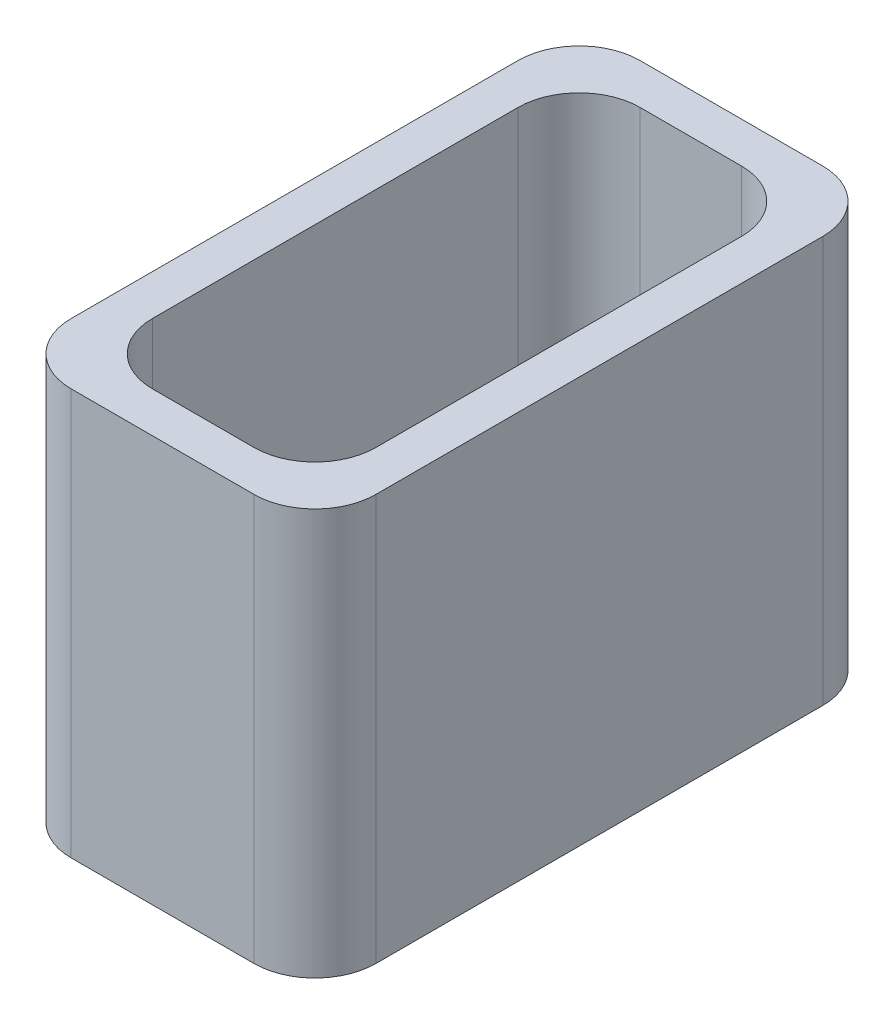
ISO-10303-21;
HEADER;
FILE_DESCRIPTION(('STEP AP214'),'2;1');
FILE_NAME('part.step','',(''),(''),'','','');
FILE_SCHEMA(('AUTOMOTIVE_DESIGN { 1 0 10303 214 1 1 1 1 }'));
ENDSEC;
DATA;
#1=APPLICATION_CONTEXT('core data for automotive mechanical design processes');
#2=APPLICATION_PROTOCOL_DEFINITION('international standard','automotive_design',2000,#1);
#3=PRODUCT_CONTEXT('',#1,'mechanical');
#4=PRODUCT('Part','Part','',(#3));
#5=PRODUCT_RELATED_PRODUCT_CATEGORY('part','',(#4));
#6=PRODUCT_DEFINITION_FORMATION('','',#4);
#7=PRODUCT_DEFINITION_CONTEXT('part definition',#1,'design');
#8=PRODUCT_DEFINITION('design','',#6,#7);
#9=PRODUCT_DEFINITION_SHAPE('','',#8);
#10=(LENGTH_UNIT() NAMED_UNIT(*) SI_UNIT(.MILLI.,.METRE.));
#11=(NAMED_UNIT(*) PLANE_ANGLE_UNIT() SI_UNIT($,.RADIAN.));
#12=(NAMED_UNIT(*) SI_UNIT($,.STERADIAN.) SOLID_ANGLE_UNIT());
#13=UNCERTAINTY_MEASURE_WITH_UNIT(LENGTH_MEASURE(1.E-05),#10,'distance_accuracy_value','');
#14=(GEOMETRIC_REPRESENTATION_CONTEXT(3) GLOBAL_UNCERTAINTY_ASSIGNED_CONTEXT((#13)) GLOBAL_UNIT_ASSIGNED_CONTEXT((#10,
#11,#12)) REPRESENTATION_CONTEXT('',''));
#15=CARTESIAN_POINT('',(0.,0.,0.));
#16=DIRECTION('',(0.,0.,1.));
#17=DIRECTION('',(1.,0.,0.));
#18=AXIS2_PLACEMENT_3D('',#15,#16,#17);
#19=CARTESIAN_POINT('',(0.,10.,0.));
#20=DIRECTION('',(0.,1.,0.));
#21=DIRECTION('',(0.,0.,1.));
#22=AXIS2_PLACEMENT_3D('',#19,#20,#21);
#23=PLANE('',#22);
#24=DIRECTION('',(-1.,0.,0.));
#25=VECTOR('',#24,1.);
#26=CARTESIAN_POINT('',(1.,10.,-1.));
#27=LINE('',#26,#25);
#28=CARTESIAN_POINT('',(-0.5,10.,-1.));
#29=VERTEX_POINT('',#28);
#30=CARTESIAN_POINT('',(-5.,10.,-1.));
#31=VERTEX_POINT('',#30);
#32=EDGE_CURVE('E198',#29,#31,#27,.T.);
#33=ORIENTED_EDGE('',*,*,#32,.T.);
#34=CARTESIAN_POINT('',(-5.,10.,0.5));
#35=DIRECTION('',(0.,1.,0.));
#36=DIRECTION('',(0.,0.,1.));
#37=AXIS2_PLACEMENT_3D('',#34,#35,#36);
#38=CIRCLE('',#37,1.5);
#39=CARTESIAN_POINT('',(-6.5,10.,0.5));
#40=VERTEX_POINT('',#39);
#41=EDGE_CURVE('E223',#31,#40,#38,.T.);
#42=ORIENTED_EDGE('',*,*,#41,.T.);
#43=DIRECTION('',(0.,0.,1.));
#44=VECTOR('',#43,1.);
#45=CARTESIAN_POINT('',(-6.5,10.,-1.));
#46=LINE('',#45,#44);
#47=CARTESIAN_POINT('',(-6.5,10.,11.5));
#48=VERTEX_POINT('',#47);
#49=EDGE_CURVE('E174',#40,#48,#46,.T.);
#50=ORIENTED_EDGE('',*,*,#49,.T.);
#51=CARTESIAN_POINT('',(-5.,10.,11.5));
#52=DIRECTION('',(0.,1.,0.));
#53=DIRECTION('',(0.,0.,1.));
#54=AXIS2_PLACEMENT_3D('',#51,#52,#53);
#55=CIRCLE('',#54,1.5);
#56=CARTESIAN_POINT('',(-5.,10.,13.));
#57=VERTEX_POINT('',#56);
#58=EDGE_CURVE('E214',#48,#57,#55,.T.);
#59=ORIENTED_EDGE('',*,*,#58,.T.);
#60=DIRECTION('',(1.,0.,0.));
#61=VECTOR('',#60,1.);
#62=CARTESIAN_POINT('',(1.,10.,13.));
#63=LINE('',#62,#61);
#64=CARTESIAN_POINT('',(-0.5,10.,13.));
#65=VERTEX_POINT('',#64);
#66=EDGE_CURVE('E328',#57,#65,#63,.T.);
#67=ORIENTED_EDGE('',*,*,#66,.T.);
#68=CARTESIAN_POINT('',(-0.5,10.,11.5));
#69=DIRECTION('',(0.,1.,0.));
#70=DIRECTION('',(0.,0.,1.));
#71=AXIS2_PLACEMENT_3D('',#68,#69,#70);
#72=CIRCLE('',#71,1.5);
#73=CARTESIAN_POINT('',(1.,10.,11.5));
#74=VERTEX_POINT('',#73);
#75=EDGE_CURVE('E217',#65,#74,#72,.T.);
#76=ORIENTED_EDGE('',*,*,#75,.T.);
#77=DIRECTION('',(0.,0.,-1.));
#78=VECTOR('',#77,1.);
#79=CARTESIAN_POINT('',(1.,10.,-1.));
#80=LINE('',#79,#78);
#81=CARTESIAN_POINT('',(1.,10.,0.5));
#82=VERTEX_POINT('',#81);
#83=EDGE_CURVE('E200',#74,#82,#80,.T.);
#84=ORIENTED_EDGE('',*,*,#83,.T.);
#85=CARTESIAN_POINT('',(-0.5,10.,0.5));
#86=DIRECTION('',(0.,1.,0.));
#87=DIRECTION('',(0.,0.,1.));
#88=AXIS2_PLACEMENT_3D('',#85,#86,#87);
#89=CIRCLE('',#88,1.5);
#90=EDGE_CURVE('E220',#82,#29,#89,.T.);
#91=ORIENTED_EDGE('',*,*,#90,.T.);
#92=EDGE_LOOP('',(#33,#42,#50,#59,#67,#76,#84,#91));
#93=FACE_BOUND('',#92,.T.);
#94=DIRECTION('',(-1.,0.,0.));
#95=VECTOR('',#94,1.);
#96=CARTESIAN_POINT('',(0.,10.,0.));
#97=LINE('',#96,#95);
#98=CARTESIAN_POINT('',(-1.5,10.,0.));
#99=VERTEX_POINT('',#98);
#100=CARTESIAN_POINT('',(-4.,10.,0.));
#101=VERTEX_POINT('',#100);
#102=EDGE_CURVE('E304',#99,#101,#97,.T.);
#103=ORIENTED_EDGE('',*,*,#102,.F.);
#104=CARTESIAN_POINT('',(-1.5,10.,1.5));
#105=DIRECTION('',(0.,1.,0.));
#106=DIRECTION('',(0.,0.,1.));
#107=AXIS2_PLACEMENT_3D('',#104,#105,#106);
#108=CIRCLE('',#107,1.5);
#109=CARTESIAN_POINT('',(0.,10.,1.5));
#110=VERTEX_POINT('',#109);
#111=EDGE_CURVE('E270',#99,#110,#108,.F.);
#112=ORIENTED_EDGE('',*,*,#111,.T.);
#113=DIRECTION('',(0.,0.,-1.));
#114=VECTOR('',#113,1.);
#115=CARTESIAN_POINT('',(0.,10.,0.));
#116=LINE('',#115,#114);
#117=CARTESIAN_POINT('',(0.,10.,10.5));
#118=VERTEX_POINT('',#117);
#119=EDGE_CURVE('E298',#118,#110,#116,.T.);
#120=ORIENTED_EDGE('',*,*,#119,.F.);
#121=CARTESIAN_POINT('',(-1.5,10.,10.5));
#122=DIRECTION('',(0.,1.,0.));
#123=DIRECTION('',(0.,0.,1.));
#124=AXIS2_PLACEMENT_3D('',#121,#122,#123);
#125=CIRCLE('',#124,1.5);
#126=CARTESIAN_POINT('',(-1.5,10.,12.));
#127=VERTEX_POINT('',#126);
#128=EDGE_CURVE('E282',#118,#127,#125,.F.);
#129=ORIENTED_EDGE('',*,*,#128,.T.);
#130=DIRECTION('',(1.,0.,0.));
#131=VECTOR('',#130,1.);
#132=CARTESIAN_POINT('',(0.,10.,12.));
#133=LINE('',#132,#131);
#134=CARTESIAN_POINT('',(-4.,10.,12.));
#135=VERTEX_POINT('',#134);
#136=EDGE_CURVE('E191',#135,#127,#133,.T.);
#137=ORIENTED_EDGE('',*,*,#136,.F.);
#138=CARTESIAN_POINT('',(-4.,10.,10.5));
#139=DIRECTION('',(0.,1.,0.));
#140=DIRECTION('',(0.,0.,1.));
#141=AXIS2_PLACEMENT_3D('',#138,#139,#140);
#142=CIRCLE('',#141,1.5);
#143=CARTESIAN_POINT('',(-5.5,10.,10.5));
#144=VERTEX_POINT('',#143);
#145=EDGE_CURVE('E11',#135,#144,#142,.F.);
#146=ORIENTED_EDGE('',*,*,#145,.T.);
#147=DIRECTION('',(0.,0.,1.));
#148=VECTOR('',#147,1.);
#149=CARTESIAN_POINT('',(-5.5,10.,0.));
#150=LINE('',#149,#148);
#151=CARTESIAN_POINT('',(-5.5,10.,1.5));
#152=VERTEX_POINT('',#151);
#153=EDGE_CURVE('E301',#152,#144,#150,.T.);
#154=ORIENTED_EDGE('',*,*,#153,.F.);
#155=CARTESIAN_POINT('',(-4.,10.,1.5));
#156=DIRECTION('',(0.,1.,0.));
#157=DIRECTION('',(0.,0.,1.));
#158=AXIS2_PLACEMENT_3D('',#155,#156,#157);
#159=CIRCLE('',#158,1.5);
#160=EDGE_CURVE('E276',#152,#101,#159,.F.);
#161=ORIENTED_EDGE('',*,*,#160,.T.);
#162=EDGE_LOOP('',(#103,#112,#120,#129,#137,#146,#154,#161));
#163=FACE_BOUND('',#162,.T.);
#164=ADVANCED_FACE('F39',(#93,#163),#23,.T.);
#165=CARTESIAN_POINT('',(0.,0.,0.));
#166=DIRECTION('',(0.,1.,0.));
#167=DIRECTION('',(0.,0.,1.));
#168=AXIS2_PLACEMENT_3D('',#165,#166,#167);
#169=PLANE('',#168);
#170=DIRECTION('',(0.,0.,1.));
#171=VECTOR('',#170,1.);
#172=CARTESIAN_POINT('',(-6.5,0.,-1.));
#173=LINE('',#172,#171);
#174=CARTESIAN_POINT('',(-6.5,0.,0.5));
#175=VERTEX_POINT('',#174);
#176=CARTESIAN_POINT('',(-6.5,0.,11.5));
#177=VERTEX_POINT('',#176);
#178=EDGE_CURVE('E171',#175,#177,#173,.T.);
#179=ORIENTED_EDGE('',*,*,#178,.F.);
#180=CARTESIAN_POINT('',(-5.,0.,0.5));
#181=DIRECTION('',(0.,1.,0.));
#182=DIRECTION('',(0.,0.,1.));
#183=AXIS2_PLACEMENT_3D('',#180,#181,#182);
#184=CIRCLE('',#183,1.5);
#185=CARTESIAN_POINT('',(-5.,0.,-1.));
#186=VERTEX_POINT('',#185);
#187=EDGE_CURVE('E153',#175,#186,#184,.F.);
#188=ORIENTED_EDGE('',*,*,#187,.T.);
#189=DIRECTION('',(-1.,0.,0.));
#190=VECTOR('',#189,1.);
#191=CARTESIAN_POINT('',(1.,0.,-1.));
#192=LINE('',#191,#190);
#193=CARTESIAN_POINT('',(-0.5,0.,-1.));
#194=VERTEX_POINT('',#193);
#195=EDGE_CURVE('E184',#194,#186,#192,.T.);
#196=ORIENTED_EDGE('',*,*,#195,.F.);
#197=CARTESIAN_POINT('',(-0.5,0.,0.5));
#198=DIRECTION('',(0.,1.,0.));
#199=DIRECTION('',(0.,0.,1.));
#200=AXIS2_PLACEMENT_3D('',#197,#198,#199);
#201=CIRCLE('',#200,1.5);
#202=CARTESIAN_POINT('',(1.,0.,0.5));
#203=VERTEX_POINT('',#202);
#204=EDGE_CURVE('E165',#194,#203,#201,.F.);
#205=ORIENTED_EDGE('',*,*,#204,.T.);
#206=DIRECTION('',(0.,0.,-1.));
#207=VECTOR('',#206,1.);
#208=CARTESIAN_POINT('',(1.,0.,-1.));
#209=LINE('',#208,#207);
#210=CARTESIAN_POINT('',(1.,0.,11.5));
#211=VERTEX_POINT('',#210);
#212=EDGE_CURVE('E189',#211,#203,#209,.T.);
#213=ORIENTED_EDGE('',*,*,#212,.F.);
#214=CARTESIAN_POINT('',(-0.5,0.,11.5));
#215=DIRECTION('',(0.,1.,0.));
#216=DIRECTION('',(0.,0.,1.));
#217=AXIS2_PLACEMENT_3D('',#214,#215,#216);
#218=CIRCLE('',#217,1.5);
#219=CARTESIAN_POINT('',(-0.5,0.,13.));
#220=VERTEX_POINT('',#219);
#221=EDGE_CURVE('E204',#211,#220,#218,.F.);
#222=ORIENTED_EDGE('',*,*,#221,.T.);
#223=DIRECTION('',(1.,0.,0.));
#224=VECTOR('',#223,1.);
#225=CARTESIAN_POINT('',(1.,0.,13.));
#226=LINE('',#225,#224);
#227=CARTESIAN_POINT('',(-5.,0.,13.));
#228=VERTEX_POINT('',#227);
#229=EDGE_CURVE('E183',#228,#220,#226,.T.);
#230=ORIENTED_EDGE('',*,*,#229,.F.);
#231=CARTESIAN_POINT('',(-5.,0.,11.5));
#232=DIRECTION('',(0.,1.,0.));
#233=DIRECTION('',(0.,0.,1.));
#234=AXIS2_PLACEMENT_3D('',#231,#232,#233);
#235=CIRCLE('',#234,1.5);
#236=EDGE_CURVE('E176',#228,#177,#235,.F.);
#237=ORIENTED_EDGE('',*,*,#236,.T.);
#238=EDGE_LOOP('',(#179,#188,#196,#205,#213,#222,#230,#237));
#239=FACE_BOUND('',#238,.T.);
#240=DIRECTION('',(1.,0.,0.));
#241=VECTOR('',#240,1.);
#242=CARTESIAN_POINT('',(0.,0.,12.));
#243=LINE('',#242,#241);
#244=CARTESIAN_POINT('',(-4.,0.,12.));
#245=VERTEX_POINT('',#244);
#246=CARTESIAN_POINT('',(-1.5,0.,12.));
#247=VERTEX_POINT('',#246);
#248=EDGE_CURVE('E288',#245,#247,#243,.T.);
#249=ORIENTED_EDGE('',*,*,#248,.T.);
#250=CARTESIAN_POINT('',(-1.5,0.,10.5));
#251=DIRECTION('',(0.,1.,0.));
#252=DIRECTION('',(0.,0.,1.));
#253=AXIS2_PLACEMENT_3D('',#250,#251,#252);
#254=CIRCLE('',#253,1.5);
#255=CARTESIAN_POINT('',(0.,0.,10.5));
#256=VERTEX_POINT('',#255);
#257=EDGE_CURVE('E279',#247,#256,#254,.T.);
#258=ORIENTED_EDGE('',*,*,#257,.T.);
#259=DIRECTION('',(0.,0.,-1.));
#260=VECTOR('',#259,1.);
#261=CARTESIAN_POINT('',(0.,0.,0.));
#262=LINE('',#261,#260);
#263=CARTESIAN_POINT('',(0.,0.,1.5));
#264=VERTEX_POINT('',#263);
#265=EDGE_CURVE('E313',#256,#264,#262,.T.);
#266=ORIENTED_EDGE('',*,*,#265,.T.);
#267=CARTESIAN_POINT('',(-1.5,0.,1.5));
#268=DIRECTION('',(0.,1.,0.));
#269=DIRECTION('',(0.,0.,1.));
#270=AXIS2_PLACEMENT_3D('',#267,#268,#269);
#271=CIRCLE('',#270,1.5);
#272=CARTESIAN_POINT('',(-1.5,0.,0.));
#273=VERTEX_POINT('',#272);
#274=EDGE_CURVE('E267',#264,#273,#271,.T.);
#275=ORIENTED_EDGE('',*,*,#274,.T.);
#276=DIRECTION('',(-1.,0.,0.));
#277=VECTOR('',#276,1.);
#278=CARTESIAN_POINT('',(0.,0.,0.));
#279=LINE('',#278,#277);
#280=CARTESIAN_POINT('',(-4.,0.,0.));
#281=VERTEX_POINT('',#280);
#282=EDGE_CURVE('E317',#273,#281,#279,.T.);
#283=ORIENTED_EDGE('',*,*,#282,.T.);
#284=CARTESIAN_POINT('',(-4.,0.,1.5));
#285=DIRECTION('',(0.,1.,0.));
#286=DIRECTION('',(0.,0.,1.));
#287=AXIS2_PLACEMENT_3D('',#284,#285,#286);
#288=CIRCLE('',#287,1.5);
#289=CARTESIAN_POINT('',(-5.5,0.,1.5));
#290=VERTEX_POINT('',#289);
#291=EDGE_CURVE('E273',#281,#290,#288,.T.);
#292=ORIENTED_EDGE('',*,*,#291,.T.);
#293=DIRECTION('',(0.,0.,1.));
#294=VECTOR('',#293,1.);
#295=CARTESIAN_POINT('',(-5.5,0.,0.));
#296=LINE('',#295,#294);
#297=CARTESIAN_POINT('',(-5.5,0.,10.5));
#298=VERTEX_POINT('',#297);
#299=EDGE_CURVE('E289',#290,#298,#296,.T.);
#300=ORIENTED_EDGE('',*,*,#299,.T.);
#301=CARTESIAN_POINT('',(-4.,0.,10.5));
#302=DIRECTION('',(0.,1.,0.));
#303=DIRECTION('',(0.,0.,1.));
#304=AXIS2_PLACEMENT_3D('',#301,#302,#303);
#305=CIRCLE('',#304,1.5);
#306=EDGE_CURVE('E48',#298,#245,#305,.T.);
#307=ORIENTED_EDGE('',*,*,#306,.T.);
#308=EDGE_LOOP('',(#249,#258,#266,#275,#283,#292,#300,#307));
#309=FACE_BOUND('',#308,.T.);
#310=ADVANCED_FACE('F179',(#239,#309),#169,.F.);
#311=CARTESIAN_POINT('',(1.,10.,-1.));
#312=DIRECTION('',(0.,0.,1.));
#313=DIRECTION('',(1.,0.,0.));
#314=AXIS2_PLACEMENT_3D('',#311,#312,#313);
#315=PLANE('',#314);
#316=ORIENTED_EDGE('',*,*,#195,.T.);
#317=DIRECTION('',(0.,-1.,0.));
#318=VECTOR('',#317,1.);
#319=CARTESIAN_POINT('',(-5.,10.,-1.));
#320=LINE('',#319,#318);
#321=EDGE_CURVE('E158',#186,#31,#320,.F.);
#322=ORIENTED_EDGE('',*,*,#321,.T.);
#323=ORIENTED_EDGE('',*,*,#32,.F.);
#324=DIRECTION('',(0.,-1.,0.));
#325=VECTOR('',#324,1.);
#326=CARTESIAN_POINT('',(-0.5,10.,-1.));
#327=LINE('',#326,#325);
#328=EDGE_CURVE('E164',#29,#194,#327,.T.);
#329=ORIENTED_EDGE('',*,*,#328,.T.);
#330=EDGE_LOOP('',(#316,#322,#323,#329));
#331=FACE_BOUND('',#330,.T.);
#332=ADVANCED_FACE('F345',(#331),#315,.F.);
#333=CARTESIAN_POINT('',(-6.5,10.,-1.));
#334=DIRECTION('',(1.,0.,0.));
#335=DIRECTION('',(0.,0.,-1.));
#336=AXIS2_PLACEMENT_3D('',#333,#334,#335);
#337=PLANE('',#336);
#338=ORIENTED_EDGE('',*,*,#49,.F.);
#339=DIRECTION('',(0.,-1.,0.));
#340=VECTOR('',#339,1.);
#341=CARTESIAN_POINT('',(-6.5,10.,0.5));
#342=LINE('',#341,#340);
#343=EDGE_CURVE('E157',#40,#175,#342,.T.);
#344=ORIENTED_EDGE('',*,*,#343,.T.);
#345=ORIENTED_EDGE('',*,*,#178,.T.);
#346=DIRECTION('',(0.,-1.,0.));
#347=VECTOR('',#346,1.);
#348=CARTESIAN_POINT('',(-6.5,10.,11.5));
#349=LINE('',#348,#347);
#350=EDGE_CURVE('E177',#177,#48,#349,.F.);
#351=ORIENTED_EDGE('',*,*,#350,.T.);
#352=EDGE_LOOP('',(#338,#344,#345,#351));
#353=FACE_BOUND('',#352,.T.);
#354=ADVANCED_FACE('F170',(#353),#337,.F.);
#355=CARTESIAN_POINT('',(1.,10.,13.));
#356=DIRECTION('',(0.,0.,-1.));
#357=DIRECTION('',(-1.,0.,0.));
#358=AXIS2_PLACEMENT_3D('',#355,#356,#357);
#359=PLANE('',#358);
#360=ORIENTED_EDGE('',*,*,#229,.T.);
#361=DIRECTION('',(0.,-1.,0.));
#362=VECTOR('',#361,1.);
#363=CARTESIAN_POINT('',(-0.5,10.,13.));
#364=LINE('',#363,#362);
#365=EDGE_CURVE('E237',#220,#65,#364,.F.);
#366=ORIENTED_EDGE('',*,*,#365,.T.);
#367=ORIENTED_EDGE('',*,*,#66,.F.);
#368=DIRECTION('',(0.,-1.,0.));
#369=VECTOR('',#368,1.);
#370=CARTESIAN_POINT('',(-5.,10.,13.));
#371=LINE('',#370,#369);
#372=EDGE_CURVE('E233',#57,#228,#371,.T.);
#373=ORIENTED_EDGE('',*,*,#372,.T.);
#374=EDGE_LOOP('',(#360,#366,#367,#373));
#375=FACE_BOUND('',#374,.T.);
#376=ADVANCED_FACE('F352',(#375),#359,.F.);
#377=CARTESIAN_POINT('',(1.,10.,-1.));
#378=DIRECTION('',(-1.,0.,0.));
#379=DIRECTION('',(0.,0.,1.));
#380=AXIS2_PLACEMENT_3D('',#377,#378,#379);
#381=PLANE('',#380);
#382=ORIENTED_EDGE('',*,*,#212,.T.);
#383=DIRECTION('',(0.,-1.,0.));
#384=VECTOR('',#383,1.);
#385=CARTESIAN_POINT('',(1.,10.,0.5));
#386=LINE('',#385,#384);
#387=EDGE_CURVE('E230',#203,#82,#386,.F.);
#388=ORIENTED_EDGE('',*,*,#387,.T.);
#389=ORIENTED_EDGE('',*,*,#83,.F.);
#390=DIRECTION('',(0.,-1.,0.));
#391=VECTOR('',#390,1.);
#392=CARTESIAN_POINT('',(1.,10.,11.5));
#393=LINE('',#392,#391);
#394=EDGE_CURVE('E226',#74,#211,#393,.T.);
#395=ORIENTED_EDGE('',*,*,#394,.T.);
#396=EDGE_LOOP('',(#382,#388,#389,#395));
#397=FACE_BOUND('',#396,.T.);
#398=ADVANCED_FACE('F347',(#397),#381,.F.);
#399=CARTESIAN_POINT('',(0.,10.,0.));
#400=DIRECTION('',(-1.,0.,0.));
#401=DIRECTION('',(0.,0.,1.));
#402=AXIS2_PLACEMENT_3D('',#399,#400,#401);
#403=PLANE('',#402);
#404=ORIENTED_EDGE('',*,*,#119,.T.);
#405=DIRECTION('',(0.,-1.,0.));
#406=VECTOR('',#405,1.);
#407=CARTESIAN_POINT('',(0.,0.,1.5));
#408=LINE('',#407,#406);
#409=EDGE_CURVE('E243',#110,#264,#408,.T.);
#410=ORIENTED_EDGE('',*,*,#409,.T.);
#411=ORIENTED_EDGE('',*,*,#265,.F.);
#412=DIRECTION('',(0.,-1.,0.));
#413=VECTOR('',#412,1.);
#414=CARTESIAN_POINT('',(0.,10.,10.5));
#415=LINE('',#414,#413);
#416=EDGE_CURVE('E240',#256,#118,#415,.F.);
#417=ORIENTED_EDGE('',*,*,#416,.T.);
#418=EDGE_LOOP('',(#404,#410,#411,#417));
#419=FACE_BOUND('',#418,.T.);
#420=ADVANCED_FACE('F376',(#419),#403,.T.);
#421=CARTESIAN_POINT('',(0.,10.,0.));
#422=DIRECTION('',(0.,0.,1.));
#423=DIRECTION('',(1.,0.,0.));
#424=AXIS2_PLACEMENT_3D('',#421,#422,#423);
#425=PLANE('',#424);
#426=ORIENTED_EDGE('',*,*,#282,.F.);
#427=DIRECTION('',(0.,-1.,0.));
#428=VECTOR('',#427,1.);
#429=CARTESIAN_POINT('',(-1.5,10.,0.));
#430=LINE('',#429,#428);
#431=EDGE_CURVE('E251',#273,#99,#430,.F.);
#432=ORIENTED_EDGE('',*,*,#431,.T.);
#433=ORIENTED_EDGE('',*,*,#102,.T.);
#434=DIRECTION('',(0.,-1.,0.));
#435=VECTOR('',#434,1.);
#436=CARTESIAN_POINT('',(-4.,0.,0.));
#437=LINE('',#436,#435);
#438=EDGE_CURVE('E247',#101,#281,#437,.T.);
#439=ORIENTED_EDGE('',*,*,#438,.T.);
#440=EDGE_LOOP('',(#426,#432,#433,#439));
#441=FACE_BOUND('',#440,.T.);
#442=ADVANCED_FACE('F451',(#441),#425,.T.);
#443=CARTESIAN_POINT('',(-5.5,10.,0.));
#444=DIRECTION('',(1.,0.,0.));
#445=DIRECTION('',(0.,0.,-1.));
#446=AXIS2_PLACEMENT_3D('',#443,#444,#445);
#447=PLANE('',#446);
#448=ORIENTED_EDGE('',*,*,#299,.F.);
#449=DIRECTION('',(0.,-1.,0.));
#450=VECTOR('',#449,1.);
#451=CARTESIAN_POINT('',(-5.5,10.,1.5));
#452=LINE('',#451,#450);
#453=EDGE_CURVE('E60',#290,#152,#452,.F.);
#454=ORIENTED_EDGE('',*,*,#453,.T.);
#455=ORIENTED_EDGE('',*,*,#153,.T.);
#456=DIRECTION('',(0.,-1.,0.));
#457=VECTOR('',#456,1.);
#458=CARTESIAN_POINT('',(-5.5,0.,10.5));
#459=LINE('',#458,#457);
#460=EDGE_CURVE('E254',#144,#298,#459,.T.);
#461=ORIENTED_EDGE('',*,*,#460,.T.);
#462=EDGE_LOOP('',(#448,#454,#455,#461));
#463=FACE_BOUND('',#462,.T.);
#464=ADVANCED_FACE('F300',(#463),#447,.T.);
#465=CARTESIAN_POINT('',(0.,10.,12.));
#466=DIRECTION('',(0.,0.,-1.));
#467=DIRECTION('',(-1.,0.,0.));
#468=AXIS2_PLACEMENT_3D('',#465,#466,#467);
#469=PLANE('',#468);
#470=ORIENTED_EDGE('',*,*,#136,.T.);
#471=DIRECTION('',(0.,-1.,0.));
#472=VECTOR('',#471,1.);
#473=CARTESIAN_POINT('',(-1.5,0.,12.));
#474=LINE('',#473,#472);
#475=EDGE_CURVE('E263',#127,#247,#474,.T.);
#476=ORIENTED_EDGE('',*,*,#475,.T.);
#477=ORIENTED_EDGE('',*,*,#248,.F.);
#478=DIRECTION('',(0.,-1.,0.));
#479=VECTOR('',#478,1.);
#480=CARTESIAN_POINT('',(-4.,10.,12.));
#481=LINE('',#480,#479);
#482=EDGE_CURVE('E260',#245,#135,#481,.F.);
#483=ORIENTED_EDGE('',*,*,#482,.T.);
#484=EDGE_LOOP('',(#470,#476,#477,#483));
#485=FACE_BOUND('',#484,.T.);
#486=ADVANCED_FACE('F295',(#485),#469,.T.);
#487=CARTESIAN_POINT('',(-5.,10.,0.5));
#488=DIRECTION('',(0.,-1.,0.));
#489=DIRECTION('',(0.,0.,-1.));
#490=AXIS2_PLACEMENT_3D('',#487,#488,#489);
#491=CYLINDRICAL_SURFACE('',#490,1.5);
#492=ORIENTED_EDGE('',*,*,#41,.F.);
#493=ORIENTED_EDGE('',*,*,#321,.F.);
#494=ORIENTED_EDGE('',*,*,#187,.F.);
#495=ORIENTED_EDGE('',*,*,#343,.F.);
#496=EDGE_LOOP('',(#492,#493,#494,#495));
#497=FACE_BOUND('',#496,.T.);
#498=ADVANCED_FACE('F156',(#497),#491,.T.);
#499=CARTESIAN_POINT('',(-0.5,10.,0.5));
#500=DIRECTION('',(0.,-1.,0.));
#501=DIRECTION('',(0.,0.,-1.));
#502=AXIS2_PLACEMENT_3D('',#499,#500,#501);
#503=CYLINDRICAL_SURFACE('',#502,1.5);
#504=ORIENTED_EDGE('',*,*,#90,.F.);
#505=ORIENTED_EDGE('',*,*,#387,.F.);
#506=ORIENTED_EDGE('',*,*,#204,.F.);
#507=ORIENTED_EDGE('',*,*,#328,.F.);
#508=EDGE_LOOP('',(#504,#505,#506,#507));
#509=FACE_BOUND('',#508,.T.);
#510=ADVANCED_FACE('F343',(#509),#503,.T.);
#511=CARTESIAN_POINT('',(-0.5,10.,11.5));
#512=DIRECTION('',(0.,-1.,0.));
#513=DIRECTION('',(0.,0.,-1.));
#514=AXIS2_PLACEMENT_3D('',#511,#512,#513);
#515=CYLINDRICAL_SURFACE('',#514,1.5);
#516=ORIENTED_EDGE('',*,*,#75,.F.);
#517=ORIENTED_EDGE('',*,*,#365,.F.);
#518=ORIENTED_EDGE('',*,*,#221,.F.);
#519=ORIENTED_EDGE('',*,*,#394,.F.);
#520=EDGE_LOOP('',(#516,#517,#518,#519));
#521=FACE_BOUND('',#520,.T.);
#522=ADVANCED_FACE('F349',(#521),#515,.T.);
#523=CARTESIAN_POINT('',(-5.,10.,11.5));
#524=DIRECTION('',(0.,-1.,0.));
#525=DIRECTION('',(0.,0.,-1.));
#526=AXIS2_PLACEMENT_3D('',#523,#524,#525);
#527=CYLINDRICAL_SURFACE('',#526,1.5);
#528=ORIENTED_EDGE('',*,*,#58,.F.);
#529=ORIENTED_EDGE('',*,*,#350,.F.);
#530=ORIENTED_EDGE('',*,*,#236,.F.);
#531=ORIENTED_EDGE('',*,*,#372,.F.);
#532=EDGE_LOOP('',(#528,#529,#530,#531));
#533=FACE_BOUND('',#532,.T.);
#534=ADVANCED_FACE('F357',(#533),#527,.T.);
#535=CARTESIAN_POINT('',(-1.5,10.,1.5));
#536=DIRECTION('',(0.,1.,0.));
#537=DIRECTION('',(0.,0.,1.));
#538=AXIS2_PLACEMENT_3D('',#535,#536,#537);
#539=CYLINDRICAL_SURFACE('',#538,1.5);
#540=ORIENTED_EDGE('',*,*,#111,.F.);
#541=ORIENTED_EDGE('',*,*,#431,.F.);
#542=ORIENTED_EDGE('',*,*,#274,.F.);
#543=ORIENTED_EDGE('',*,*,#409,.F.);
#544=EDGE_LOOP('',(#540,#541,#542,#543));
#545=FACE_BOUND('',#544,.T.);
#546=ADVANCED_FACE('F359',(#545),#539,.F.);
#547=CARTESIAN_POINT('',(-4.,10.,1.5));
#548=DIRECTION('',(0.,1.,0.));
#549=DIRECTION('',(0.,0.,1.));
#550=AXIS2_PLACEMENT_3D('',#547,#548,#549);
#551=CYLINDRICAL_SURFACE('',#550,1.5);
#552=ORIENTED_EDGE('',*,*,#160,.F.);
#553=ORIENTED_EDGE('',*,*,#453,.F.);
#554=ORIENTED_EDGE('',*,*,#291,.F.);
#555=ORIENTED_EDGE('',*,*,#438,.F.);
#556=EDGE_LOOP('',(#552,#553,#554,#555));
#557=FACE_BOUND('',#556,.T.);
#558=ADVANCED_FACE('F365',(#557),#551,.F.);
#559=CARTESIAN_POINT('',(-1.5,10.,10.5));
#560=DIRECTION('',(0.,1.,0.));
#561=DIRECTION('',(0.,0.,1.));
#562=AXIS2_PLACEMENT_3D('',#559,#560,#561);
#563=CYLINDRICAL_SURFACE('',#562,1.5);
#564=ORIENTED_EDGE('',*,*,#128,.F.);
#565=ORIENTED_EDGE('',*,*,#416,.F.);
#566=ORIENTED_EDGE('',*,*,#257,.F.);
#567=ORIENTED_EDGE('',*,*,#475,.F.);
#568=EDGE_LOOP('',(#564,#565,#566,#567));
#569=FACE_BOUND('',#568,.T.);
#570=ADVANCED_FACE('F418',(#569),#563,.F.);
#571=CARTESIAN_POINT('',(-4.,10.,10.5));
#572=DIRECTION('',(0.,1.,0.));
#573=DIRECTION('',(0.,0.,1.));
#574=AXIS2_PLACEMENT_3D('',#571,#572,#573);
#575=CYLINDRICAL_SURFACE('',#574,1.5);
#576=ORIENTED_EDGE('',*,*,#145,.F.);
#577=ORIENTED_EDGE('',*,*,#482,.F.);
#578=ORIENTED_EDGE('',*,*,#306,.F.);
#579=ORIENTED_EDGE('',*,*,#460,.F.);
#580=EDGE_LOOP('',(#576,#577,#578,#579));
#581=FACE_BOUND('',#580,.T.);
#582=ADVANCED_FACE('F41',(#581),#575,.F.);
#583=CLOSED_SHELL('',(#164,#310,#332,#354,#376,#398,#420,#442,#464,#486,#498,#510,#522,#534,
#546,#558,#570,#582));
#584=MANIFOLD_SOLID_BREP('B2',#583);
#585=ADVANCED_BREP_SHAPE_REPRESENTATION('',(#18,#584),#14);
#586=SHAPE_DEFINITION_REPRESENTATION(#9,#585);
ENDSEC;
END-ISO-10303-21;
